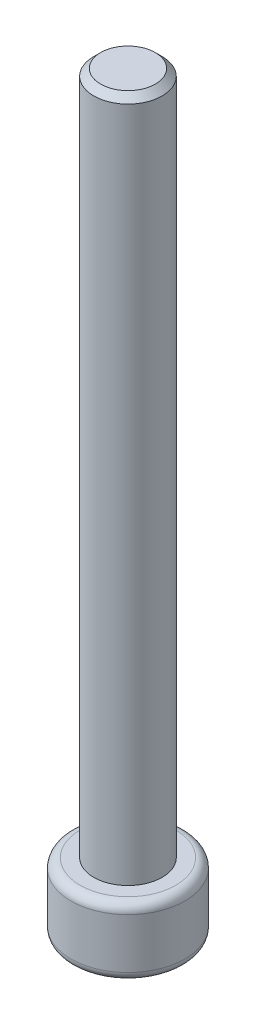
ISO-10303-21;
HEADER;
FILE_DESCRIPTION(('STEP AP214'),'2;1');
FILE_NAME('part.step','',(''),(''),'','','');
FILE_SCHEMA(('AUTOMOTIVE_DESIGN { 1 0 10303 214 1 1 1 1 }'));
ENDSEC;
DATA;
#1=APPLICATION_CONTEXT('core data for automotive mechanical design processes');
#2=APPLICATION_PROTOCOL_DEFINITION('international standard','automotive_design',2000,#1);
#3=PRODUCT_CONTEXT('',#1,'mechanical');
#4=PRODUCT('Part','Part','',(#3));
#5=PRODUCT_RELATED_PRODUCT_CATEGORY('part','',(#4));
#6=PRODUCT_DEFINITION_FORMATION('','',#4);
#7=PRODUCT_DEFINITION_CONTEXT('part definition',#1,'design');
#8=PRODUCT_DEFINITION('design','',#6,#7);
#9=PRODUCT_DEFINITION_SHAPE('','',#8);
#10=(LENGTH_UNIT() NAMED_UNIT(*) SI_UNIT(.MILLI.,.METRE.));
#11=(NAMED_UNIT(*) PLANE_ANGLE_UNIT() SI_UNIT($,.RADIAN.));
#12=(NAMED_UNIT(*) SI_UNIT($,.STERADIAN.) SOLID_ANGLE_UNIT());
#13=UNCERTAINTY_MEASURE_WITH_UNIT(LENGTH_MEASURE(1.E-05),#10,'distance_accuracy_value','');
#14=(GEOMETRIC_REPRESENTATION_CONTEXT(3) GLOBAL_UNCERTAINTY_ASSIGNED_CONTEXT((#13)) GLOBAL_UNIT_ASSIGNED_CONTEXT((#10,
#11,#12)) REPRESENTATION_CONTEXT('',''));
#15=CARTESIAN_POINT('',(0.,0.,0.));
#16=DIRECTION('',(0.,0.,1.));
#17=DIRECTION('',(1.,0.,0.));
#18=AXIS2_PLACEMENT_3D('',#15,#16,#17);
#19=CARTESIAN_POINT('',(0.,3.,0.));
#20=DIRECTION('',(0.,-1.,0.));
#21=DIRECTION('',(0.,0.,-1.));
#22=AXIS2_PLACEMENT_3D('',#19,#20,#21);
#23=CYLINDRICAL_SURFACE('',#22,2.5);
#24=CARTESIAN_POINT('',(0.,0.4,0.));
#25=DIRECTION('',(0.,1.,0.));
#26=DIRECTION('',(0.,0.,1.));
#27=AXIS2_PLACEMENT_3D('',#24,#25,#26);
#28=CIRCLE('',#27,2.5);
#29=CARTESIAN_POINT('',(0.,0.4,2.5));
#30=VERTEX_POINT('',#29);
#31=EDGE_CURVE('E187',#30,#30,#28,.T.);
#32=ORIENTED_EDGE('',*,*,#31,.T.);
#33=EDGE_LOOP('',(#32));
#34=FACE_BOUND('',#33,.T.);
#35=CARTESIAN_POINT('',(0.,2.6,0.));
#36=DIRECTION('',(0.,1.,0.));
#37=DIRECTION('',(0.,0.,1.));
#38=AXIS2_PLACEMENT_3D('',#35,#36,#37);
#39=CIRCLE('',#38,2.5);
#40=CARTESIAN_POINT('',(0.,2.6,2.5));
#41=VERTEX_POINT('',#40);
#42=EDGE_CURVE('E183',#41,#41,#39,.F.);
#43=ORIENTED_EDGE('',*,*,#42,.T.);
#44=EDGE_LOOP('',(#43));
#45=FACE_BOUND('',#44,.T.);
#46=ADVANCED_FACE('F47',(#34,#45),#23,.T.);
#47=CARTESIAN_POINT('',(0.,3.,0.));
#48=DIRECTION('',(0.,1.,0.));
#49=DIRECTION('',(0.,0.,1.));
#50=AXIS2_PLACEMENT_3D('',#47,#48,#49);
#51=PLANE('',#50);
#52=CARTESIAN_POINT('',(0.,3.,0.));
#53=DIRECTION('',(0.,1.,0.));
#54=DIRECTION('',(0.,0.,1.));
#55=AXIS2_PLACEMENT_3D('',#52,#53,#54);
#56=CIRCLE('',#55,2.1);
#57=CARTESIAN_POINT('',(0.,3.,2.1));
#58=VERTEX_POINT('',#57);
#59=EDGE_CURVE('E11',#58,#58,#56,.T.);
#60=ORIENTED_EDGE('',*,*,#59,.T.);
#61=EDGE_LOOP('',(#60));
#62=FACE_BOUND('',#61,.T.);
#63=CARTESIAN_POINT('',(0.,3.,0.));
#64=DIRECTION('',(0.,1.,0.));
#65=DIRECTION('',(0.,0.,1.));
#66=AXIS2_PLACEMENT_3D('',#63,#64,#65);
#67=CIRCLE('',#66,1.5);
#68=CARTESIAN_POINT('',(0.,3.,1.5));
#69=VERTEX_POINT('',#68);
#70=EDGE_CURVE('E162',#69,#69,#67,.T.);
#71=ORIENTED_EDGE('',*,*,#70,.F.);
#72=EDGE_LOOP('',(#71));
#73=FACE_BOUND('',#72,.T.);
#74=ADVANCED_FACE('F204',(#62,#73),#51,.T.);
#75=CARTESIAN_POINT('',(0.,0.,0.));
#76=DIRECTION('',(0.,1.,0.));
#77=DIRECTION('',(0.,0.,1.));
#78=AXIS2_PLACEMENT_3D('',#75,#76,#77);
#79=PLANE('',#78);
#80=DIRECTION('',(-0.5,0.,0.866025403784438));
#81=VECTOR('',#80,1.);
#82=CARTESIAN_POINT('',(1.44337567297406,0.,0.));
#83=LINE('',#82,#81);
#84=CARTESIAN_POINT('',(1.44337567297406,0.,0.));
#85=VERTEX_POINT('',#84);
#86=CARTESIAN_POINT('',(0.721687836487032,0.,1.25));
#87=VERTEX_POINT('',#86);
#88=EDGE_CURVE('E143',#85,#87,#83,.T.);
#89=ORIENTED_EDGE('',*,*,#88,.F.);
#90=DIRECTION('',(0.5,0.,0.866025403784439));
#91=VECTOR('',#90,1.);
#92=CARTESIAN_POINT('',(0.721687836487033,0.,-1.25));
#93=LINE('',#92,#91);
#94=CARTESIAN_POINT('',(0.721687836487033,0.,-1.25));
#95=VERTEX_POINT('',#94);
#96=EDGE_CURVE('E63',#95,#85,#93,.T.);
#97=ORIENTED_EDGE('',*,*,#96,.F.);
#98=DIRECTION('',(1.,0.,0.));
#99=VECTOR('',#98,1.);
#100=CARTESIAN_POINT('',(-0.721687836487032,0.,-1.25));
#101=LINE('',#100,#99);
#102=CARTESIAN_POINT('',(-0.721687836487032,0.,-1.25));
#103=VERTEX_POINT('',#102);
#104=EDGE_CURVE('E156',#103,#95,#101,.T.);
#105=ORIENTED_EDGE('',*,*,#104,.F.);
#106=DIRECTION('',(0.5,0.,-0.866025403784439));
#107=VECTOR('',#106,1.);
#108=CARTESIAN_POINT('',(-1.44337567297406,0.,0.));
#109=LINE('',#108,#107);
#110=CARTESIAN_POINT('',(-1.44337567297406,0.,0.));
#111=VERTEX_POINT('',#110);
#112=EDGE_CURVE('E153',#111,#103,#109,.T.);
#113=ORIENTED_EDGE('',*,*,#112,.F.);
#114=DIRECTION('',(-0.5,0.,-0.866025403784439));
#115=VECTOR('',#114,1.);
#116=CARTESIAN_POINT('',(-0.721687836487032,0.,1.25));
#117=LINE('',#116,#115);
#118=CARTESIAN_POINT('',(-0.721687836487032,0.,1.25));
#119=VERTEX_POINT('',#118);
#120=EDGE_CURVE('E111',#119,#111,#117,.T.);
#121=ORIENTED_EDGE('',*,*,#120,.F.);
#122=DIRECTION('',(-1.,0.,0.));
#123=VECTOR('',#122,1.);
#124=CARTESIAN_POINT('',(0.721687836487032,0.,1.25));
#125=LINE('',#124,#123);
#126=EDGE_CURVE('E147',#87,#119,#125,.T.);
#127=ORIENTED_EDGE('',*,*,#126,.F.);
#128=EDGE_LOOP('',(#89,#97,#105,#113,#121,#127));
#129=FACE_BOUND('',#128,.T.);
#130=CARTESIAN_POINT('',(0.,0.,0.));
#131=DIRECTION('',(0.,1.,0.));
#132=DIRECTION('',(0.,0.,1.));
#133=AXIS2_PLACEMENT_3D('',#130,#131,#132);
#134=CIRCLE('',#133,2.1);
#135=CARTESIAN_POINT('',(0.,0.,2.1));
#136=VERTEX_POINT('',#135);
#137=EDGE_CURVE('E56',#136,#136,#134,.F.);
#138=ORIENTED_EDGE('',*,*,#137,.T.);
#139=EDGE_LOOP('',(#138));
#140=FACE_BOUND('',#139,.T.);
#141=ADVANCED_FACE('F194',(#129,#140),#79,.F.);
#142=CARTESIAN_POINT('',(0.,33.,0.));
#143=DIRECTION('',(0.,-1.,0.));
#144=DIRECTION('',(0.,0.,-1.));
#145=AXIS2_PLACEMENT_3D('',#142,#143,#144);
#146=CYLINDRICAL_SURFACE('',#145,1.5);
#147=CARTESIAN_POINT('',(0.,32.7,0.));
#148=DIRECTION('',(0.,1.,0.));
#149=DIRECTION('',(0.,0.,1.));
#150=AXIS2_PLACEMENT_3D('',#147,#148,#149);
#151=CIRCLE('',#150,1.5);
#152=CARTESIAN_POINT('',(0.,32.7,1.5));
#153=VERTEX_POINT('',#152);
#154=EDGE_CURVE('E179',#153,#153,#151,.F.);
#155=ORIENTED_EDGE('',*,*,#154,.T.);
#156=EDGE_LOOP('',(#155));
#157=FACE_BOUND('',#156,.T.);
#158=ORIENTED_EDGE('',*,*,#70,.T.);
#159=EDGE_LOOP('',(#158));
#160=FACE_BOUND('',#159,.T.);
#161=ADVANCED_FACE('F218',(#157,#160),#146,.T.);
#162=CARTESIAN_POINT('',(0.,33.,0.));
#163=DIRECTION('',(0.,1.,0.));
#164=DIRECTION('',(0.,0.,1.));
#165=AXIS2_PLACEMENT_3D('',#162,#163,#164);
#166=PLANE('',#165);
#167=CARTESIAN_POINT('',(0.,33.,0.));
#168=DIRECTION('',(0.,1.,0.));
#169=DIRECTION('',(0.,0.,1.));
#170=AXIS2_PLACEMENT_3D('',#167,#168,#169);
#171=CIRCLE('',#170,1.2);
#172=CARTESIAN_POINT('',(0.,33.,1.2));
#173=VERTEX_POINT('',#172);
#174=EDGE_CURVE('E175',#173,#173,#171,.T.);
#175=ORIENTED_EDGE('',*,*,#174,.T.);
#176=EDGE_LOOP('',(#175));
#177=FACE_BOUND('',#176,.T.);
#178=ADVANCED_FACE('F220',(#177),#166,.T.);
#179=CARTESIAN_POINT('',(0.,33.,0.));
#180=DIRECTION('',(0.,-1.,0.));
#181=DIRECTION('',(0.,0.,-1.));
#182=AXIS2_PLACEMENT_3D('',#179,#180,#181);
#183=CONICAL_SURFACE('',#182,1.2,0.785398163397441);
#184=ORIENTED_EDGE('',*,*,#154,.F.);
#185=EDGE_LOOP('',(#184));
#186=FACE_BOUND('',#185,.T.);
#187=ORIENTED_EDGE('',*,*,#174,.F.);
#188=EDGE_LOOP('',(#187));
#189=FACE_BOUND('',#188,.T.);
#190=ADVANCED_FACE('F199',(#186,#189),#183,.T.);
#191=CARTESIAN_POINT('',(0.,0.4,0.));
#192=DIRECTION('',(0.,1.,0.));
#193=DIRECTION('',(0.,0.,1.));
#194=AXIS2_PLACEMENT_3D('',#191,#192,#193);
#195=TOROIDAL_SURFACE('',#194,2.1,0.4);
#196=ORIENTED_EDGE('',*,*,#137,.F.);
#197=EDGE_LOOP('',(#196));
#198=FACE_BOUND('',#197,.T.);
#199=ORIENTED_EDGE('',*,*,#31,.F.);
#200=EDGE_LOOP('',(#199));
#201=FACE_BOUND('',#200,.T.);
#202=ADVANCED_FACE('F196',(#198,#201),#195,.T.);
#203=CARTESIAN_POINT('',(0.,2.6,0.));
#204=DIRECTION('',(0.,1.,0.));
#205=DIRECTION('',(0.,0.,1.));
#206=AXIS2_PLACEMENT_3D('',#203,#204,#205);
#207=TOROIDAL_SURFACE('',#206,2.1,0.4);
#208=ORIENTED_EDGE('',*,*,#42,.F.);
#209=EDGE_LOOP('',(#208));
#210=FACE_BOUND('',#209,.T.);
#211=ORIENTED_EDGE('',*,*,#59,.F.);
#212=EDGE_LOOP('',(#211));
#213=FACE_BOUND('',#212,.T.);
#214=ADVANCED_FACE('F49',(#210,#213),#207,.T.);
#215=CARTESIAN_POINT('',(0.721687836487033,1.5,-1.25));
#216=DIRECTION('',(0.866025403784439,0.,-0.5));
#217=DIRECTION('',(-0.5,0.,-0.866025403784439));
#218=AXIS2_PLACEMENT_3D('',#215,#216,#217);
#219=PLANE('',#218);
#220=ORIENTED_EDGE('',*,*,#96,.T.);
#221=DIRECTION('',(0.,-1.,0.));
#222=VECTOR('',#221,1.);
#223=CARTESIAN_POINT('',(1.44337567297406,1.5,0.));
#224=LINE('',#223,#222);
#225=CARTESIAN_POINT('',(1.44337567297406,1.5,0.));
#226=VERTEX_POINT('',#225);
#227=EDGE_CURVE('E93',#226,#85,#224,.T.);
#228=ORIENTED_EDGE('',*,*,#227,.F.);
#229=DIRECTION('',(0.5,0.,0.866025403784439));
#230=VECTOR('',#229,1.);
#231=CARTESIAN_POINT('',(0.721687836487033,1.5,-1.25));
#232=LINE('',#231,#230);
#233=CARTESIAN_POINT('',(0.721687836487033,1.5,-1.25));
#234=VERTEX_POINT('',#233);
#235=EDGE_CURVE('E159',#234,#226,#232,.T.);
#236=ORIENTED_EDGE('',*,*,#235,.F.);
#237=DIRECTION('',(0.,-1.,0.));
#238=VECTOR('',#237,1.);
#239=CARTESIAN_POINT('',(0.721687836487033,1.5,-1.25));
#240=LINE('',#239,#238);
#241=EDGE_CURVE('E71',#234,#95,#240,.T.);
#242=ORIENTED_EDGE('',*,*,#241,.T.);
#243=EDGE_LOOP('',(#220,#228,#236,#242));
#244=FACE_BOUND('',#243,.T.);
#245=ADVANCED_FACE('F210',(#244),#219,.F.);
#246=CARTESIAN_POINT('',(-0.721687836487032,1.5,-1.25));
#247=DIRECTION('',(0.,0.,-1.));
#248=DIRECTION('',(-1.,0.,0.));
#249=AXIS2_PLACEMENT_3D('',#246,#247,#248);
#250=PLANE('',#249);
#251=ORIENTED_EDGE('',*,*,#104,.T.);
#252=ORIENTED_EDGE('',*,*,#241,.F.);
#253=DIRECTION('',(1.,0.,0.));
#254=VECTOR('',#253,1.);
#255=CARTESIAN_POINT('',(-0.721687836487032,1.5,-1.25));
#256=LINE('',#255,#254);
#257=CARTESIAN_POINT('',(-0.721687836487032,1.5,-1.25));
#258=VERTEX_POINT('',#257);
#259=EDGE_CURVE('E125',#258,#234,#256,.T.);
#260=ORIENTED_EDGE('',*,*,#259,.F.);
#261=DIRECTION('',(0.,-1.,0.));
#262=VECTOR('',#261,1.);
#263=CARTESIAN_POINT('',(-0.721687836487032,1.5,-1.25));
#264=LINE('',#263,#262);
#265=EDGE_CURVE('E116',#258,#103,#264,.T.);
#266=ORIENTED_EDGE('',*,*,#265,.T.);
#267=EDGE_LOOP('',(#251,#252,#260,#266));
#268=FACE_BOUND('',#267,.T.);
#269=ADVANCED_FACE('F277',(#268),#250,.F.);
#270=CARTESIAN_POINT('',(-1.44337567297406,1.5,0.));
#271=DIRECTION('',(-0.866025403784439,0.,-0.5));
#272=DIRECTION('',(-0.5,0.,0.866025403784439));
#273=AXIS2_PLACEMENT_3D('',#270,#271,#272);
#274=PLANE('',#273);
#275=ORIENTED_EDGE('',*,*,#112,.T.);
#276=ORIENTED_EDGE('',*,*,#265,.F.);
#277=DIRECTION('',(0.5,0.,-0.866025403784439));
#278=VECTOR('',#277,1.);
#279=CARTESIAN_POINT('',(-1.44337567297406,1.5,0.));
#280=LINE('',#279,#278);
#281=CARTESIAN_POINT('',(-1.44337567297406,1.5,0.));
#282=VERTEX_POINT('',#281);
#283=EDGE_CURVE('E120',#282,#258,#280,.T.);
#284=ORIENTED_EDGE('',*,*,#283,.F.);
#285=DIRECTION('',(0.,-1.,0.));
#286=VECTOR('',#285,1.);
#287=CARTESIAN_POINT('',(-1.44337567297406,1.5,0.));
#288=LINE('',#287,#286);
#289=EDGE_CURVE('E104',#282,#111,#288,.T.);
#290=ORIENTED_EDGE('',*,*,#289,.T.);
#291=EDGE_LOOP('',(#275,#276,#284,#290));
#292=FACE_BOUND('',#291,.T.);
#293=ADVANCED_FACE('F121',(#292),#274,.F.);
#294=CARTESIAN_POINT('',(-0.721687836487032,1.5,1.25));
#295=DIRECTION('',(-0.866025403784439,0.,0.5));
#296=DIRECTION('',(0.5,0.,0.866025403784439));
#297=AXIS2_PLACEMENT_3D('',#294,#295,#296);
#298=PLANE('',#297);
#299=ORIENTED_EDGE('',*,*,#120,.T.);
#300=ORIENTED_EDGE('',*,*,#289,.F.);
#301=DIRECTION('',(-0.5,0.,-0.866025403784439));
#302=VECTOR('',#301,1.);
#303=CARTESIAN_POINT('',(-0.721687836487032,1.5,1.25));
#304=LINE('',#303,#302);
#305=CARTESIAN_POINT('',(-0.721687836487032,1.5,1.25));
#306=VERTEX_POINT('',#305);
#307=EDGE_CURVE('E108',#306,#282,#304,.T.);
#308=ORIENTED_EDGE('',*,*,#307,.F.);
#309=DIRECTION('',(0.,-1.,0.));
#310=VECTOR('',#309,1.);
#311=CARTESIAN_POINT('',(-0.721687836487032,1.5,1.25));
#312=LINE('',#311,#310);
#313=EDGE_CURVE('E117',#306,#119,#312,.T.);
#314=ORIENTED_EDGE('',*,*,#313,.T.);
#315=EDGE_LOOP('',(#299,#300,#308,#314));
#316=FACE_BOUND('',#315,.T.);
#317=ADVANCED_FACE('F106',(#316),#298,.F.);
#318=CARTESIAN_POINT('',(0.721687836487032,1.5,1.25));
#319=DIRECTION('',(0.,0.,1.));
#320=DIRECTION('',(1.,0.,0.));
#321=AXIS2_PLACEMENT_3D('',#318,#319,#320);
#322=PLANE('',#321);
#323=ORIENTED_EDGE('',*,*,#126,.T.);
#324=ORIENTED_EDGE('',*,*,#313,.F.);
#325=DIRECTION('',(-1.,0.,0.));
#326=VECTOR('',#325,1.);
#327=CARTESIAN_POINT('',(0.721687836487032,1.5,1.25));
#328=LINE('',#327,#326);
#329=CARTESIAN_POINT('',(0.721687836487032,1.5,1.25));
#330=VERTEX_POINT('',#329);
#331=EDGE_CURVE('E131',#330,#306,#328,.T.);
#332=ORIENTED_EDGE('',*,*,#331,.F.);
#333=DIRECTION('',(0.,-1.,0.));
#334=VECTOR('',#333,1.);
#335=CARTESIAN_POINT('',(0.721687836487032,1.5,1.25));
#336=LINE('',#335,#334);
#337=EDGE_CURVE('E167',#330,#87,#336,.T.);
#338=ORIENTED_EDGE('',*,*,#337,.T.);
#339=EDGE_LOOP('',(#323,#324,#332,#338));
#340=FACE_BOUND('',#339,.T.);
#341=ADVANCED_FACE('F298',(#340),#322,.F.);
#342=CARTESIAN_POINT('',(1.44337567297406,1.5,0.));
#343=DIRECTION('',(0.866025403784439,0.,0.5));
#344=DIRECTION('',(0.5,0.,-0.866025403784439));
#345=AXIS2_PLACEMENT_3D('',#342,#343,#344);
#346=PLANE('',#345);
#347=ORIENTED_EDGE('',*,*,#88,.T.);
#348=ORIENTED_EDGE('',*,*,#337,.F.);
#349=DIRECTION('',(-0.5,0.,0.866025403784438));
#350=VECTOR('',#349,1.);
#351=CARTESIAN_POINT('',(1.44337567297406,1.5,0.));
#352=LINE('',#351,#350);
#353=EDGE_CURVE('E135',#226,#330,#352,.T.);
#354=ORIENTED_EDGE('',*,*,#353,.F.);
#355=ORIENTED_EDGE('',*,*,#227,.T.);
#356=EDGE_LOOP('',(#347,#348,#354,#355));
#357=FACE_BOUND('',#356,.T.);
#358=ADVANCED_FACE('F306',(#357),#346,.F.);
#359=CARTESIAN_POINT('',(0.,1.5,0.));
#360=DIRECTION('',(0.,-1.,0.));
#361=DIRECTION('',(0.,0.,-1.));
#362=AXIS2_PLACEMENT_3D('',#359,#360,#361);
#363=PLANE('',#362);
#364=ORIENTED_EDGE('',*,*,#235,.T.);
#365=ORIENTED_EDGE('',*,*,#353,.T.);
#366=ORIENTED_EDGE('',*,*,#331,.T.);
#367=ORIENTED_EDGE('',*,*,#307,.T.);
#368=ORIENTED_EDGE('',*,*,#283,.T.);
#369=ORIENTED_EDGE('',*,*,#259,.T.);
#370=EDGE_LOOP('',(#364,#365,#366,#367,#368,#369));
#371=FACE_BOUND('',#370,.T.);
#372=ADVANCED_FACE('F128',(#371),#363,.T.);
#373=CLOSED_SHELL('',(#46,#74,#141,#161,#178,#190,#202,#214,#245,#269,#293,#317,#341,#358,#372));
#374=MANIFOLD_SOLID_BREP('B2',#373);
#375=ADVANCED_BREP_SHAPE_REPRESENTATION('',(#18,#374),#14);
#376=SHAPE_DEFINITION_REPRESENTATION(#9,#375);
ENDSEC;
END-ISO-10303-21;
